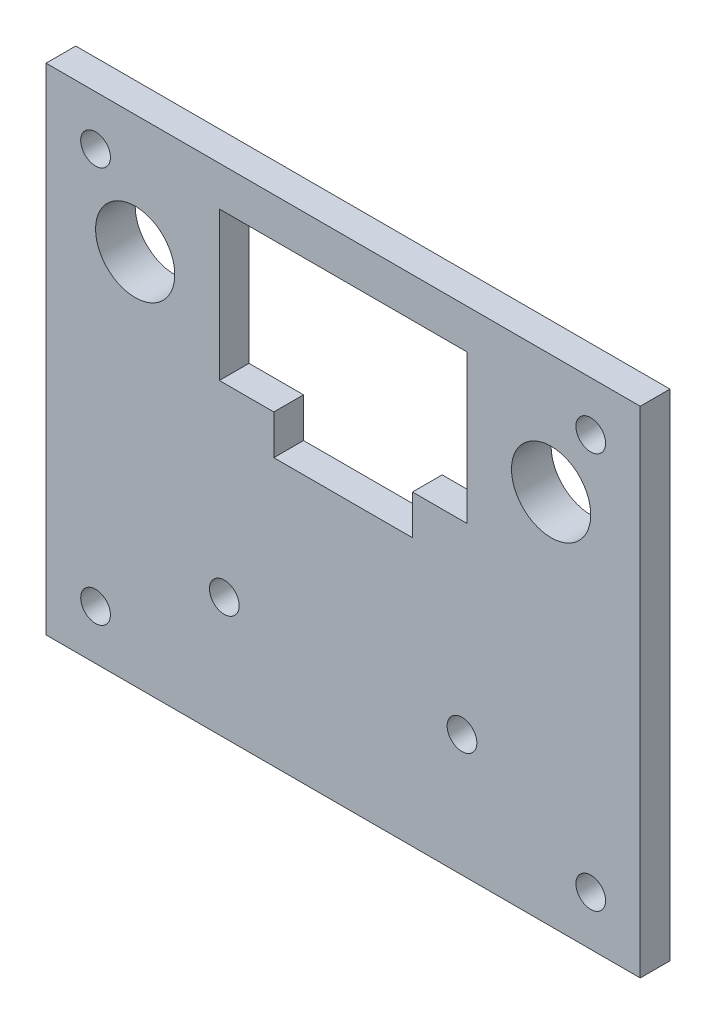
ISO-10303-21;
HEADER;
FILE_DESCRIPTION(('STEP AP214'),'2;1');
FILE_NAME('part.step','',(''),(''),'','','');
FILE_SCHEMA(('AUTOMOTIVE_DESIGN { 1 0 10303 214 1 1 1 1 }'));
ENDSEC;
DATA;
#1=APPLICATION_CONTEXT('core data for automotive mechanical design processes');
#2=APPLICATION_PROTOCOL_DEFINITION('international standard','automotive_design',2000,#1);
#3=PRODUCT_CONTEXT('',#1,'mechanical');
#4=PRODUCT('Part','Part','',(#3));
#5=PRODUCT_RELATED_PRODUCT_CATEGORY('part','',(#4));
#6=PRODUCT_DEFINITION_FORMATION('','',#4);
#7=PRODUCT_DEFINITION_CONTEXT('part definition',#1,'design');
#8=PRODUCT_DEFINITION('design','',#6,#7);
#9=PRODUCT_DEFINITION_SHAPE('','',#8);
#10=(LENGTH_UNIT() NAMED_UNIT(*) SI_UNIT(.MILLI.,.METRE.));
#11=(NAMED_UNIT(*) PLANE_ANGLE_UNIT() SI_UNIT($,.RADIAN.));
#12=(NAMED_UNIT(*) SI_UNIT($,.STERADIAN.) SOLID_ANGLE_UNIT());
#13=UNCERTAINTY_MEASURE_WITH_UNIT(LENGTH_MEASURE(1.E-05),#10,'distance_accuracy_value','');
#14=(GEOMETRIC_REPRESENTATION_CONTEXT(3) GLOBAL_UNCERTAINTY_ASSIGNED_CONTEXT((#13)) GLOBAL_UNIT_ASSIGNED_CONTEXT((#10,
#11,#12)) REPRESENTATION_CONTEXT('',''));
#15=CARTESIAN_POINT('',(0.,0.,0.));
#16=DIRECTION('',(0.,0.,1.));
#17=DIRECTION('',(1.,0.,0.));
#18=AXIS2_PLACEMENT_3D('',#15,#16,#17);
#19=CARTESIAN_POINT('',(0.,0.,0.));
#20=DIRECTION('',(0.,0.,-1.));
#21=DIRECTION('',(-1.,0.,0.));
#22=AXIS2_PLACEMENT_3D('',#19,#20,#21);
#23=PLANE('',#22);
#24=CARTESIAN_POINT('',(12.0005726945969,-12.6995313706004,0.));
#25=DIRECTION('',(0.,0.,-1.));
#26=DIRECTION('',(-1.,0.,0.));
#27=AXIS2_PLACEMENT_3D('',#24,#25,#26);
#28=CIRCLE('',#27,1.5);
#29=CARTESIAN_POINT('',(10.5005726945969,-12.6995313706004,0.));
#30=VERTEX_POINT('',#29);
#31=EDGE_CURVE('E294',#30,#30,#28,.T.);
#32=ORIENTED_EDGE('',*,*,#31,.F.);
#33=EDGE_LOOP('',(#32));
#34=FACE_BOUND('',#33,.T.);
#35=CARTESIAN_POINT('',(-12.0005726945969,-12.6995313706004,0.));
#36=DIRECTION('',(0.,0.,-1.));
#37=DIRECTION('',(1.,0.,0.));
#38=AXIS2_PLACEMENT_3D('',#35,#36,#37);
#39=CIRCLE('',#38,1.5);
#40=CARTESIAN_POINT('',(-10.5005726945969,-12.6995313706004,0.));
#41=VERTEX_POINT('',#40);
#42=EDGE_CURVE('E300',#41,#41,#39,.T.);
#43=ORIENTED_EDGE('',*,*,#42,.F.);
#44=EDGE_LOOP('',(#43));
#45=FACE_BOUND('',#44,.T.);
#46=CARTESIAN_POINT('',(-25.,20.,0.));
#47=DIRECTION('',(0.,0.,-1.));
#48=DIRECTION('',(1.,0.,0.));
#49=AXIS2_PLACEMENT_3D('',#46,#47,#48);
#50=CIRCLE('',#49,1.5);
#51=CARTESIAN_POINT('',(-23.5,20.,0.));
#52=VERTEX_POINT('',#51);
#53=EDGE_CURVE('E320',#52,#52,#50,.T.);
#54=ORIENTED_EDGE('',*,*,#53,.F.);
#55=EDGE_LOOP('',(#54));
#56=FACE_BOUND('',#55,.T.);
#57=CARTESIAN_POINT('',(-25.,-20.,0.));
#58=DIRECTION('',(0.,0.,-1.));
#59=DIRECTION('',(-1.,0.,0.));
#60=AXIS2_PLACEMENT_3D('',#57,#58,#59);
#61=CIRCLE('',#60,1.5);
#62=CARTESIAN_POINT('',(-26.5,-20.,0.));
#63=VERTEX_POINT('',#62);
#64=EDGE_CURVE('E314',#63,#63,#61,.T.);
#65=ORIENTED_EDGE('',*,*,#64,.F.);
#66=EDGE_LOOP('',(#65));
#67=FACE_BOUND('',#66,.T.);
#68=CARTESIAN_POINT('',(25.,-20.,0.));
#69=DIRECTION('',(0.,0.,-1.));
#70=DIRECTION('',(1.,0.,0.));
#71=AXIS2_PLACEMENT_3D('',#68,#69,#70);
#72=CIRCLE('',#71,1.5);
#73=CARTESIAN_POINT('',(26.5,-20.,0.));
#74=VERTEX_POINT('',#73);
#75=EDGE_CURVE('E307',#74,#74,#72,.T.);
#76=ORIENTED_EDGE('',*,*,#75,.F.);
#77=EDGE_LOOP('',(#76));
#78=FACE_BOUND('',#77,.T.);
#79=CARTESIAN_POINT('',(25.,20.,0.));
#80=DIRECTION('',(0.,0.,-1.));
#81=DIRECTION('',(-1.,0.,0.));
#82=AXIS2_PLACEMENT_3D('',#79,#80,#81);
#83=CIRCLE('',#82,1.5);
#84=CARTESIAN_POINT('',(23.5,20.,0.));
#85=VERTEX_POINT('',#84);
#86=EDGE_CURVE('E310',#85,#85,#83,.T.);
#87=ORIENTED_EDGE('',*,*,#86,.F.);
#88=EDGE_LOOP('',(#87));
#89=FACE_BOUND('',#88,.T.);
#90=DIRECTION('',(0.,-1.,0.));
#91=VECTOR('',#90,1.);
#92=CARTESIAN_POINT('',(7.,5.99999999999999,0.));
#93=LINE('',#92,#91);
#94=CARTESIAN_POINT('',(7.,5.99999999999999,0.));
#95=VERTEX_POINT('',#94);
#96=CARTESIAN_POINT('',(7.,1.99999999999999,0.));
#97=VERTEX_POINT('',#96);
#98=EDGE_CURVE('E178',#95,#97,#93,.T.);
#99=ORIENTED_EDGE('',*,*,#98,.F.);
#100=DIRECTION('',(-1.,0.,0.));
#101=VECTOR('',#100,1.);
#102=CARTESIAN_POINT('',(-12.5,6.,0.));
#103=LINE('',#102,#101);
#104=CARTESIAN_POINT('',(12.5,5.99999999999999,0.));
#105=VERTEX_POINT('',#104);
#106=EDGE_CURVE('E225',#105,#95,#103,.T.);
#107=ORIENTED_EDGE('',*,*,#106,.F.);
#108=DIRECTION('',(0.,-1.,0.));
#109=VECTOR('',#108,1.);
#110=CARTESIAN_POINT('',(12.5,21.,0.));
#111=LINE('',#110,#109);
#112=CARTESIAN_POINT('',(12.5,21.,0.));
#113=VERTEX_POINT('',#112);
#114=EDGE_CURVE('E202',#113,#105,#111,.T.);
#115=ORIENTED_EDGE('',*,*,#114,.F.);
#116=DIRECTION('',(1.,0.,0.));
#117=VECTOR('',#116,1.);
#118=CARTESIAN_POINT('',(12.5,21.,0.));
#119=LINE('',#118,#117);
#120=CARTESIAN_POINT('',(-12.5,21.,0.));
#121=VERTEX_POINT('',#120);
#122=EDGE_CURVE('E212',#121,#113,#119,.T.);
#123=ORIENTED_EDGE('',*,*,#122,.F.);
#124=DIRECTION('',(0.,1.,0.));
#125=VECTOR('',#124,1.);
#126=CARTESIAN_POINT('',(-12.5,21.,0.));
#127=LINE('',#126,#125);
#128=CARTESIAN_POINT('',(-12.5,6.,0.));
#129=VERTEX_POINT('',#128);
#130=EDGE_CURVE('E228',#129,#121,#127,.T.);
#131=ORIENTED_EDGE('',*,*,#130,.F.);
#132=CARTESIAN_POINT('',(-7.,6.,0.));
#133=VERTEX_POINT('',#132);
#134=EDGE_CURVE('E224',#133,#129,#103,.T.);
#135=ORIENTED_EDGE('',*,*,#134,.F.);
#136=DIRECTION('',(0.,1.,0.));
#137=VECTOR('',#136,1.);
#138=CARTESIAN_POINT('',(-7.,5.99999999999999,0.));
#139=LINE('',#138,#137);
#140=CARTESIAN_POINT('',(-7.,1.99999999999999,0.));
#141=VERTEX_POINT('',#140);
#142=EDGE_CURVE('E67',#141,#133,#139,.T.);
#143=ORIENTED_EDGE('',*,*,#142,.F.);
#144=DIRECTION('',(-1.,0.,0.));
#145=VECTOR('',#144,1.);
#146=CARTESIAN_POINT('',(7.,1.99999999999999,0.));
#147=LINE('',#146,#145);
#148=EDGE_CURVE('E181',#97,#141,#147,.T.);
#149=ORIENTED_EDGE('',*,*,#148,.F.);
#150=EDGE_LOOP('',(#99,#107,#115,#123,#131,#135,#143,#149));
#151=FACE_BOUND('',#150,.T.);
#152=CARTESIAN_POINT('',(-21.,13.,0.));
#153=DIRECTION('',(0.,0.,-1.));
#154=DIRECTION('',(-1.,0.,0.));
#155=AXIS2_PLACEMENT_3D('',#152,#153,#154);
#156=CIRCLE('',#155,5.);
#157=CARTESIAN_POINT('',(-26.,13.,0.));
#158=VERTEX_POINT('',#157);
#159=EDGE_CURVE('E254',#158,#158,#156,.T.);
#160=ORIENTED_EDGE('',*,*,#159,.F.);
#161=EDGE_LOOP('',(#160));
#162=FACE_BOUND('',#161,.T.);
#163=CARTESIAN_POINT('',(21.,13.,0.));
#164=DIRECTION('',(0.,0.,-1.));
#165=DIRECTION('',(-1.,0.,0.));
#166=AXIS2_PLACEMENT_3D('',#163,#164,#165);
#167=CIRCLE('',#166,5.);
#168=CARTESIAN_POINT('',(16.,13.,0.));
#169=VERTEX_POINT('',#168);
#170=EDGE_CURVE('E243',#169,#169,#167,.T.);
#171=ORIENTED_EDGE('',*,*,#170,.F.);
#172=EDGE_LOOP('',(#171));
#173=FACE_BOUND('',#172,.T.);
#174=DIRECTION('',(1.,0.,0.));
#175=VECTOR('',#174,1.);
#176=CARTESIAN_POINT('',(-30.,-25.,0.));
#177=LINE('',#176,#175);
#178=CARTESIAN_POINT('',(7.00057269459692,-25.,0.));
#179=VERTEX_POINT('',#178);
#180=CARTESIAN_POINT('',(30.,-25.,0.));
#181=VERTEX_POINT('',#180);
#182=EDGE_CURVE('E284',#179,#181,#177,.T.);
#183=ORIENTED_EDGE('',*,*,#182,.F.);
#184=DIRECTION('',(0.,-1.,0.));
#185=VECTOR('',#184,1.);
#186=CARTESIAN_POINT('',(7.00057269459692,-2.28661922185326,0.));
#187=LINE('',#186,#185);
#188=CARTESIAN_POINT('',(7.00057269459692,-2.28661922185326,0.));
#189=VERTEX_POINT('',#188);
#190=EDGE_CURVE('E59',#189,#179,#187,.T.);
#191=ORIENTED_EDGE('',*,*,#190,.F.);
#192=DIRECTION('',(1.,0.,0.));
#193=VECTOR('',#192,1.);
#194=CARTESIAN_POINT('',(7.00057269459692,-2.28661922185326,0.));
#195=LINE('',#194,#193);
#196=CARTESIAN_POINT('',(-7.42271778170829,-2.28661922185326,0.));
#197=VERTEX_POINT('',#196);
#198=EDGE_CURVE('E175',#197,#189,#195,.T.);
#199=ORIENTED_EDGE('',*,*,#198,.F.);
#200=DIRECTION('',(0.,1.,0.));
#201=VECTOR('',#200,1.);
#202=CARTESIAN_POINT('',(-7.42271778170829,-2.28661922185326,0.));
#203=LINE('',#202,#201);
#204=CARTESIAN_POINT('',(-7.42271778170829,-25.,0.));
#205=VERTEX_POINT('',#204);
#206=EDGE_CURVE('E334',#205,#197,#203,.T.);
#207=ORIENTED_EDGE('',*,*,#206,.F.);
#208=CARTESIAN_POINT('',(-30.,-25.,0.));
#209=VERTEX_POINT('',#208);
#210=EDGE_CURVE('E271',#209,#205,#177,.T.);
#211=ORIENTED_EDGE('',*,*,#210,.F.);
#212=DIRECTION('',(0.,-1.,0.));
#213=VECTOR('',#212,1.);
#214=CARTESIAN_POINT('',(-30.,-25.,0.));
#215=LINE('',#214,#213);
#216=CARTESIAN_POINT('',(-30.,25.,0.));
#217=VERTEX_POINT('',#216);
#218=EDGE_CURVE('E282',#217,#209,#215,.T.);
#219=ORIENTED_EDGE('',*,*,#218,.F.);
#220=DIRECTION('',(-1.,0.,0.));
#221=VECTOR('',#220,1.);
#222=CARTESIAN_POINT('',(-30.,25.,0.));
#223=LINE('',#222,#221);
#224=CARTESIAN_POINT('',(30.,25.,0.));
#225=VERTEX_POINT('',#224);
#226=EDGE_CURVE('E280',#225,#217,#223,.T.);
#227=ORIENTED_EDGE('',*,*,#226,.F.);
#228=DIRECTION('',(0.,1.,0.));
#229=VECTOR('',#228,1.);
#230=CARTESIAN_POINT('',(30.,-25.,0.));
#231=LINE('',#230,#229);
#232=EDGE_CURVE('E264',#181,#225,#231,.T.);
#233=ORIENTED_EDGE('',*,*,#232,.F.);
#234=EDGE_LOOP('',(#183,#191,#199,#207,#211,#219,#227,#233));
#235=FACE_BOUND('',#234,.T.);
#236=ADVANCED_FACE('F42',(#34,#45,#56,#67,#78,#89,#151,#162,#173,#235),#23,.T.);
#237=CARTESIAN_POINT('',(-12.5,6.,3.));
#238=DIRECTION('',(0.,-1.,0.));
#239=DIRECTION('',(1.,0.,0.));
#240=AXIS2_PLACEMENT_3D('',#237,#238,#239);
#241=PLANE('',#240);
#242=ORIENTED_EDGE('',*,*,#106,.T.);
#243=DIRECTION('',(0.,0.,-1.));
#244=VECTOR('',#243,1.);
#245=CARTESIAN_POINT('',(7.,5.99999999999999,3.));
#246=LINE('',#245,#244);
#247=CARTESIAN_POINT('',(7.,5.99999999999999,3.));
#248=VERTEX_POINT('',#247);
#249=EDGE_CURVE('E200',#248,#95,#246,.T.);
#250=ORIENTED_EDGE('',*,*,#249,.F.);
#251=DIRECTION('',(-1.,0.,0.));
#252=VECTOR('',#251,1.);
#253=CARTESIAN_POINT('',(-12.5,6.,3.));
#254=LINE('',#253,#252);
#255=CARTESIAN_POINT('',(12.5,5.99999999999999,3.));
#256=VERTEX_POINT('',#255);
#257=EDGE_CURVE('E213',#256,#248,#254,.T.);
#258=ORIENTED_EDGE('',*,*,#257,.F.);
#259=DIRECTION('',(0.,0.,-1.));
#260=VECTOR('',#259,1.);
#261=CARTESIAN_POINT('',(12.5,5.99999999999999,3.));
#262=LINE('',#261,#260);
#263=EDGE_CURVE('E222',#256,#105,#262,.T.);
#264=ORIENTED_EDGE('',*,*,#263,.T.);
#265=EDGE_LOOP('',(#242,#250,#258,#264));
#266=FACE_BOUND('',#265,.T.);
#267=ADVANCED_FACE('F368',(#266),#241,.F.);
#268=CARTESIAN_POINT('',(30.,-25.,3.));
#269=DIRECTION('',(-1.,0.,0.));
#270=DIRECTION('',(0.,0.,1.));
#271=AXIS2_PLACEMENT_3D('',#268,#269,#270);
#272=PLANE('',#271);
#273=ORIENTED_EDGE('',*,*,#232,.T.);
#274=DIRECTION('',(0.,0.,-1.));
#275=VECTOR('',#274,1.);
#276=CARTESIAN_POINT('',(30.,25.,3.));
#277=LINE('',#276,#275);
#278=CARTESIAN_POINT('',(30.,25.,3.));
#279=VERTEX_POINT('',#278);
#280=EDGE_CURVE('E11',#279,#225,#277,.T.);
#281=ORIENTED_EDGE('',*,*,#280,.F.);
#282=DIRECTION('',(0.,1.,0.));
#283=VECTOR('',#282,1.);
#284=CARTESIAN_POINT('',(30.,-25.,3.));
#285=LINE('',#284,#283);
#286=CARTESIAN_POINT('',(30.,-25.,3.));
#287=VERTEX_POINT('',#286);
#288=EDGE_CURVE('E267',#287,#279,#285,.T.);
#289=ORIENTED_EDGE('',*,*,#288,.F.);
#290=DIRECTION('',(0.,0.,-1.));
#291=VECTOR('',#290,1.);
#292=CARTESIAN_POINT('',(30.,-25.,3.));
#293=LINE('',#292,#291);
#294=EDGE_CURVE('E277',#287,#181,#293,.T.);
#295=ORIENTED_EDGE('',*,*,#294,.T.);
#296=EDGE_LOOP('',(#273,#281,#289,#295));
#297=FACE_BOUND('',#296,.T.);
#298=ADVANCED_FACE('F44',(#297),#272,.F.);
#299=CARTESIAN_POINT('',(-30.,25.,3.));
#300=DIRECTION('',(0.,-1.,0.));
#301=DIRECTION('',(0.,0.,-1.));
#302=AXIS2_PLACEMENT_3D('',#299,#300,#301);
#303=PLANE('',#302);
#304=ORIENTED_EDGE('',*,*,#226,.T.);
#305=DIRECTION('',(0.,0.,-1.));
#306=VECTOR('',#305,1.);
#307=CARTESIAN_POINT('',(-30.,25.,3.));
#308=LINE('',#307,#306);
#309=CARTESIAN_POINT('',(-30.,25.,3.));
#310=VERTEX_POINT('',#309);
#311=EDGE_CURVE('E51',#310,#217,#308,.T.);
#312=ORIENTED_EDGE('',*,*,#311,.F.);
#313=DIRECTION('',(-1.,0.,0.));
#314=VECTOR('',#313,1.);
#315=CARTESIAN_POINT('',(-30.,25.,3.));
#316=LINE('',#315,#314);
#317=EDGE_CURVE('E270',#279,#310,#316,.T.);
#318=ORIENTED_EDGE('',*,*,#317,.F.);
#319=ORIENTED_EDGE('',*,*,#280,.T.);
#320=EDGE_LOOP('',(#304,#312,#318,#319));
#321=FACE_BOUND('',#320,.T.);
#322=ADVANCED_FACE('F361',(#321),#303,.F.);
#323=CARTESIAN_POINT('',(-30.,-25.,3.));
#324=DIRECTION('',(1.,0.,0.));
#325=DIRECTION('',(0.,0.,-1.));
#326=AXIS2_PLACEMENT_3D('',#323,#324,#325);
#327=PLANE('',#326);
#328=ORIENTED_EDGE('',*,*,#218,.T.);
#329=DIRECTION('',(0.,0.,-1.));
#330=VECTOR('',#329,1.);
#331=CARTESIAN_POINT('',(-30.,-25.,3.));
#332=LINE('',#331,#330);
#333=CARTESIAN_POINT('',(-30.,-25.,3.));
#334=VERTEX_POINT('',#333);
#335=EDGE_CURVE('E288',#334,#209,#332,.T.);
#336=ORIENTED_EDGE('',*,*,#335,.F.);
#337=DIRECTION('',(0.,-1.,0.));
#338=VECTOR('',#337,1.);
#339=CARTESIAN_POINT('',(-30.,-25.,3.));
#340=LINE('',#339,#338);
#341=EDGE_CURVE('E273',#310,#334,#340,.T.);
#342=ORIENTED_EDGE('',*,*,#341,.F.);
#343=ORIENTED_EDGE('',*,*,#311,.T.);
#344=EDGE_LOOP('',(#328,#336,#342,#343));
#345=FACE_BOUND('',#344,.T.);
#346=ADVANCED_FACE('F359',(#345),#327,.F.);
#347=CARTESIAN_POINT('',(-30.,-25.,3.));
#348=DIRECTION('',(0.,1.,0.));
#349=DIRECTION('',(0.,0.,1.));
#350=AXIS2_PLACEMENT_3D('',#347,#348,#349);
#351=PLANE('',#350);
#352=ORIENTED_EDGE('',*,*,#210,.T.);
#353=DIRECTION('',(0.,0.,1.));
#354=VECTOR('',#353,1.);
#355=CARTESIAN_POINT('',(-7.42271778170829,-25.,-3.3));
#356=LINE('',#355,#354);
#357=CARTESIAN_POINT('',(-7.42271778170829,-25.,-3.3));
#358=VERTEX_POINT('',#357);
#359=EDGE_CURVE('E164',#358,#205,#356,.T.);
#360=ORIENTED_EDGE('',*,*,#359,.F.);
#361=DIRECTION('',(-1.,0.,0.));
#362=VECTOR('',#361,1.);
#363=CARTESIAN_POINT('',(7.00057269459692,-25.,-3.3));
#364=LINE('',#363,#362);
#365=CARTESIAN_POINT('',(7.00057269459692,-25.,-3.3));
#366=VERTEX_POINT('',#365);
#367=EDGE_CURVE('E158',#366,#358,#364,.T.);
#368=ORIENTED_EDGE('',*,*,#367,.F.);
#369=DIRECTION('',(0.,0.,1.));
#370=VECTOR('',#369,1.);
#371=CARTESIAN_POINT('',(7.00057269459692,-25.,-3.3));
#372=LINE('',#371,#370);
#373=EDGE_CURVE('E162',#366,#179,#372,.T.);
#374=ORIENTED_EDGE('',*,*,#373,.T.);
#375=ORIENTED_EDGE('',*,*,#182,.T.);
#376=ORIENTED_EDGE('',*,*,#294,.F.);
#377=DIRECTION('',(1.,0.,0.));
#378=VECTOR('',#377,1.);
#379=CARTESIAN_POINT('',(-30.,-25.,3.));
#380=LINE('',#379,#378);
#381=EDGE_CURVE('E275',#334,#287,#380,.T.);
#382=ORIENTED_EDGE('',*,*,#381,.F.);
#383=ORIENTED_EDGE('',*,*,#335,.T.);
#384=EDGE_LOOP('',(#352,#360,#368,#374,#375,#376,#382,#383));
#385=FACE_BOUND('',#384,.T.);
#386=ADVANCED_FACE('F161',(#385),#351,.F.);
#387=CARTESIAN_POINT('',(0.,0.,3.));
#388=DIRECTION('',(0.,0.,-1.));
#389=DIRECTION('',(-1.,0.,0.));
#390=AXIS2_PLACEMENT_3D('',#387,#388,#389);
#391=PLANE('',#390);
#392=CARTESIAN_POINT('',(12.0005726945969,-12.6995313706004,3.));
#393=DIRECTION('',(0.,0.,-1.));
#394=DIRECTION('',(-1.,0.,0.));
#395=AXIS2_PLACEMENT_3D('',#392,#393,#394);
#396=CIRCLE('',#395,1.5);
#397=CARTESIAN_POINT('',(10.5005726945969,-12.6995313706004,3.));
#398=VERTEX_POINT('',#397);
#399=EDGE_CURVE('E46',#398,#398,#396,.T.);
#400=ORIENTED_EDGE('',*,*,#399,.T.);
#401=EDGE_LOOP('',(#400));
#402=FACE_BOUND('',#401,.T.);
#403=CARTESIAN_POINT('',(-12.0005726945969,-12.6995313706004,3.));
#404=DIRECTION('',(0.,0.,-1.));
#405=DIRECTION('',(-1.,0.,0.));
#406=AXIS2_PLACEMENT_3D('',#403,#404,#405);
#407=CIRCLE('',#406,1.5);
#408=CARTESIAN_POINT('',(-13.5005726945969,-12.6995313706004,3.));
#409=VERTEX_POINT('',#408);
#410=EDGE_CURVE('E292',#409,#409,#407,.T.);
#411=ORIENTED_EDGE('',*,*,#410,.T.);
#412=EDGE_LOOP('',(#411));
#413=FACE_BOUND('',#412,.T.);
#414=CARTESIAN_POINT('',(-25.,20.,3.));
#415=DIRECTION('',(0.,0.,-1.));
#416=DIRECTION('',(1.,0.,0.));
#417=AXIS2_PLACEMENT_3D('',#414,#415,#416);
#418=CIRCLE('',#417,1.5);
#419=CARTESIAN_POINT('',(-23.5,20.,3.));
#420=VERTEX_POINT('',#419);
#421=EDGE_CURVE('E298',#420,#420,#418,.T.);
#422=ORIENTED_EDGE('',*,*,#421,.T.);
#423=EDGE_LOOP('',(#422));
#424=FACE_BOUND('',#423,.T.);
#425=CARTESIAN_POINT('',(-25.,-20.,3.));
#426=DIRECTION('',(0.,0.,-1.));
#427=DIRECTION('',(-1.,0.,0.));
#428=AXIS2_PLACEMENT_3D('',#425,#426,#427);
#429=CIRCLE('',#428,1.5);
#430=CARTESIAN_POINT('',(-26.5,-20.,3.));
#431=VERTEX_POINT('',#430);
#432=EDGE_CURVE('E317',#431,#431,#429,.T.);
#433=ORIENTED_EDGE('',*,*,#432,.T.);
#434=EDGE_LOOP('',(#433));
#435=FACE_BOUND('',#434,.T.);
#436=CARTESIAN_POINT('',(25.,-20.,3.));
#437=DIRECTION('',(0.,0.,-1.));
#438=DIRECTION('',(1.,0.,0.));
#439=AXIS2_PLACEMENT_3D('',#436,#437,#438);
#440=CIRCLE('',#439,1.5);
#441=CARTESIAN_POINT('',(26.5,-20.,3.));
#442=VERTEX_POINT('',#441);
#443=EDGE_CURVE('E311',#442,#442,#440,.T.);
#444=ORIENTED_EDGE('',*,*,#443,.T.);
#445=EDGE_LOOP('',(#444));
#446=FACE_BOUND('',#445,.T.);
#447=CARTESIAN_POINT('',(25.,20.,3.));
#448=DIRECTION('',(0.,0.,-1.));
#449=DIRECTION('',(-1.,0.,0.));
#450=AXIS2_PLACEMENT_3D('',#447,#448,#449);
#451=CIRCLE('',#450,1.5);
#452=CARTESIAN_POINT('',(23.5,20.,3.));
#453=VERTEX_POINT('',#452);
#454=EDGE_CURVE('E325',#453,#453,#451,.T.);
#455=ORIENTED_EDGE('',*,*,#454,.T.);
#456=EDGE_LOOP('',(#455));
#457=FACE_BOUND('',#456,.T.);
#458=ORIENTED_EDGE('',*,*,#257,.T.);
#459=DIRECTION('',(0.,-1.,0.));
#460=VECTOR('',#459,1.);
#461=CARTESIAN_POINT('',(7.,5.99999999999999,3.));
#462=LINE('',#461,#460);
#463=CARTESIAN_POINT('',(7.,1.99999999999999,3.));
#464=VERTEX_POINT('',#463);
#465=EDGE_CURVE('E187',#248,#464,#462,.T.);
#466=ORIENTED_EDGE('',*,*,#465,.T.);
#467=DIRECTION('',(-1.,0.,0.));
#468=VECTOR('',#467,1.);
#469=CARTESIAN_POINT('',(7.,1.99999999999999,3.));
#470=LINE('',#469,#468);
#471=CARTESIAN_POINT('',(-7.,1.99999999999999,3.));
#472=VERTEX_POINT('',#471);
#473=EDGE_CURVE('E190',#464,#472,#470,.T.);
#474=ORIENTED_EDGE('',*,*,#473,.T.);
#475=DIRECTION('',(0.,1.,0.));
#476=VECTOR('',#475,1.);
#477=CARTESIAN_POINT('',(-7.,5.99999999999999,3.));
#478=LINE('',#477,#476);
#479=CARTESIAN_POINT('',(-7.,5.99999999999999,3.));
#480=VERTEX_POINT('',#479);
#481=EDGE_CURVE('E193',#472,#480,#478,.T.);
#482=ORIENTED_EDGE('',*,*,#481,.T.);
#483=CARTESIAN_POINT('',(-12.5,6.,3.));
#484=VERTEX_POINT('',#483);
#485=EDGE_CURVE('E211',#480,#484,#254,.T.);
#486=ORIENTED_EDGE('',*,*,#485,.T.);
#487=DIRECTION('',(0.,1.,0.));
#488=VECTOR('',#487,1.);
#489=CARTESIAN_POINT('',(-12.5,21.,3.));
#490=LINE('',#489,#488);
#491=CARTESIAN_POINT('',(-12.5,21.,3.));
#492=VERTEX_POINT('',#491);
#493=EDGE_CURVE('E216',#484,#492,#490,.T.);
#494=ORIENTED_EDGE('',*,*,#493,.T.);
#495=DIRECTION('',(1.,0.,0.));
#496=VECTOR('',#495,1.);
#497=CARTESIAN_POINT('',(12.5,21.,3.));
#498=LINE('',#497,#496);
#499=CARTESIAN_POINT('',(12.5,21.,3.));
#500=VERTEX_POINT('',#499);
#501=EDGE_CURVE('E219',#492,#500,#498,.T.);
#502=ORIENTED_EDGE('',*,*,#501,.T.);
#503=DIRECTION('',(0.,-1.,0.));
#504=VECTOR('',#503,1.);
#505=CARTESIAN_POINT('',(12.5,21.,3.));
#506=LINE('',#505,#504);
#507=EDGE_CURVE('E208',#500,#256,#506,.T.);
#508=ORIENTED_EDGE('',*,*,#507,.T.);
#509=EDGE_LOOP('',(#458,#466,#474,#482,#486,#494,#502,#508));
#510=FACE_BOUND('',#509,.T.);
#511=CARTESIAN_POINT('',(-21.,13.,3.));
#512=DIRECTION('',(0.,0.,-1.));
#513=DIRECTION('',(-1.,0.,0.));
#514=AXIS2_PLACEMENT_3D('',#511,#512,#513);
#515=CIRCLE('',#514,4.);
#516=CARTESIAN_POINT('',(-25.,13.,3.));
#517=VERTEX_POINT('',#516);
#518=EDGE_CURVE('E261',#517,#517,#515,.T.);
#519=ORIENTED_EDGE('',*,*,#518,.T.);
#520=EDGE_LOOP('',(#519));
#521=FACE_BOUND('',#520,.T.);
#522=CARTESIAN_POINT('',(21.,13.,3.));
#523=DIRECTION('',(0.,0.,-1.));
#524=DIRECTION('',(1.,0.,0.));
#525=AXIS2_PLACEMENT_3D('',#522,#523,#524);
#526=CIRCLE('',#525,4.);
#527=CARTESIAN_POINT('',(25.,13.,3.));
#528=VERTEX_POINT('',#527);
#529=EDGE_CURVE('E258',#528,#528,#526,.T.);
#530=ORIENTED_EDGE('',*,*,#529,.T.);
#531=EDGE_LOOP('',(#530));
#532=FACE_BOUND('',#531,.T.);
#533=ORIENTED_EDGE('',*,*,#288,.T.);
#534=ORIENTED_EDGE('',*,*,#317,.T.);
#535=ORIENTED_EDGE('',*,*,#341,.T.);
#536=ORIENTED_EDGE('',*,*,#381,.T.);
#537=EDGE_LOOP('',(#533,#534,#535,#536));
#538=FACE_BOUND('',#537,.T.);
#539=ADVANCED_FACE('F353',(#402,#413,#424,#435,#446,#457,#510,#521,#532,#538),#391,.F.);
#540=CARTESIAN_POINT('',(21.,13.,3.));
#541=DIRECTION('',(0.,0.,-1.));
#542=DIRECTION('',(-1.,0.,0.));
#543=AXIS2_PLACEMENT_3D('',#540,#541,#542);
#544=CYLINDRICAL_SURFACE('',#543,4.);
#545=ORIENTED_EDGE('',*,*,#529,.F.);
#546=EDGE_LOOP('',(#545));
#547=FACE_BOUND('',#546,.T.);
#548=CARTESIAN_POINT('',(21.,13.,-1.));
#549=DIRECTION('',(0.,0.,-1.));
#550=DIRECTION('',(-1.,0.,0.));
#551=AXIS2_PLACEMENT_3D('',#548,#549,#550);
#552=CIRCLE('',#551,4.);
#553=CARTESIAN_POINT('',(17.,13.,-1.));
#554=VERTEX_POINT('',#553);
#555=EDGE_CURVE('E246',#554,#554,#552,.T.);
#556=ORIENTED_EDGE('',*,*,#555,.T.);
#557=EDGE_LOOP('',(#556));
#558=FACE_BOUND('',#557,.T.);
#559=ADVANCED_FACE('F388',(#547,#558),#544,.F.);
#560=CARTESIAN_POINT('',(-21.,13.,3.));
#561=DIRECTION('',(0.,0.,-1.));
#562=DIRECTION('',(-1.,0.,0.));
#563=AXIS2_PLACEMENT_3D('',#560,#561,#562);
#564=CYLINDRICAL_SURFACE('',#563,4.);
#565=ORIENTED_EDGE('',*,*,#518,.F.);
#566=EDGE_LOOP('',(#565));
#567=FACE_BOUND('',#566,.T.);
#568=CARTESIAN_POINT('',(-21.,13.,-1.));
#569=DIRECTION('',(0.,0.,-1.));
#570=DIRECTION('',(-1.,0.,0.));
#571=AXIS2_PLACEMENT_3D('',#568,#569,#570);
#572=CIRCLE('',#571,4.);
#573=CARTESIAN_POINT('',(-25.,13.,-1.));
#574=VERTEX_POINT('',#573);
#575=EDGE_CURVE('E251',#574,#574,#572,.T.);
#576=ORIENTED_EDGE('',*,*,#575,.T.);
#577=EDGE_LOOP('',(#576));
#578=FACE_BOUND('',#577,.T.);
#579=ADVANCED_FACE('F393',(#567,#578),#564,.F.);
#580=CARTESIAN_POINT('',(-21.,13.,-1.));
#581=DIRECTION('',(0.,0.,-1.));
#582=DIRECTION('',(-1.,0.,0.));
#583=AXIS2_PLACEMENT_3D('',#580,#581,#582);
#584=PLANE('',#583);
#585=CARTESIAN_POINT('',(-21.,13.,-1.));
#586=DIRECTION('',(0.,0.,-1.));
#587=DIRECTION('',(-1.,0.,0.));
#588=AXIS2_PLACEMENT_3D('',#585,#586,#587);
#589=CIRCLE('',#588,5.);
#590=CARTESIAN_POINT('',(-26.,13.,-1.));
#591=VERTEX_POINT('',#590);
#592=EDGE_CURVE('E255',#591,#591,#589,.T.);
#593=ORIENTED_EDGE('',*,*,#592,.T.);
#594=EDGE_LOOP('',(#593));
#595=FACE_BOUND('',#594,.T.);
#596=ORIENTED_EDGE('',*,*,#575,.F.);
#597=EDGE_LOOP('',(#596));
#598=FACE_BOUND('',#597,.T.);
#599=ADVANCED_FACE('F426',(#595,#598),#584,.T.);
#600=CARTESIAN_POINT('',(-21.,13.,-1.));
#601=DIRECTION('',(0.,0.,1.));
#602=DIRECTION('',(1.,0.,0.));
#603=AXIS2_PLACEMENT_3D('',#600,#601,#602);
#604=CYLINDRICAL_SURFACE('',#603,5.);
#605=ORIENTED_EDGE('',*,*,#592,.F.);
#606=EDGE_LOOP('',(#605));
#607=FACE_BOUND('',#606,.T.);
#608=ORIENTED_EDGE('',*,*,#159,.T.);
#609=EDGE_LOOP('',(#608));
#610=FACE_BOUND('',#609,.T.);
#611=ADVANCED_FACE('F416',(#607,#610),#604,.T.);
#612=CARTESIAN_POINT('',(21.,13.,-1.));
#613=DIRECTION('',(0.,0.,-1.));
#614=DIRECTION('',(-1.,0.,0.));
#615=AXIS2_PLACEMENT_3D('',#612,#613,#614);
#616=PLANE('',#615);
#617=CARTESIAN_POINT('',(21.,13.,-1.));
#618=DIRECTION('',(0.,0.,-1.));
#619=DIRECTION('',(-1.,0.,0.));
#620=AXIS2_PLACEMENT_3D('',#617,#618,#619);
#621=CIRCLE('',#620,5.);
#622=CARTESIAN_POINT('',(16.,13.,-1.));
#623=VERTEX_POINT('',#622);
#624=EDGE_CURVE('E235',#623,#623,#621,.T.);
#625=ORIENTED_EDGE('',*,*,#624,.T.);
#626=EDGE_LOOP('',(#625));
#627=FACE_BOUND('',#626,.T.);
#628=ORIENTED_EDGE('',*,*,#555,.F.);
#629=EDGE_LOOP('',(#628));
#630=FACE_BOUND('',#629,.T.);
#631=ADVANCED_FACE('F413',(#627,#630),#616,.T.);
#632=CARTESIAN_POINT('',(21.,13.,-1.));
#633=DIRECTION('',(0.,0.,1.));
#634=DIRECTION('',(1.,0.,0.));
#635=AXIS2_PLACEMENT_3D('',#632,#633,#634);
#636=CYLINDRICAL_SURFACE('',#635,5.);
#637=ORIENTED_EDGE('',*,*,#624,.F.);
#638=EDGE_LOOP('',(#637));
#639=FACE_BOUND('',#638,.T.);
#640=ORIENTED_EDGE('',*,*,#170,.T.);
#641=EDGE_LOOP('',(#640));
#642=FACE_BOUND('',#641,.T.);
#643=ADVANCED_FACE('F415',(#639,#642),#636,.T.);
#644=CARTESIAN_POINT('',(12.5,21.,3.));
#645=DIRECTION('',(1.,0.,0.));
#646=DIRECTION('',(0.,1.,0.));
#647=AXIS2_PLACEMENT_3D('',#644,#645,#646);
#648=PLANE('',#647);
#649=ORIENTED_EDGE('',*,*,#114,.T.);
#650=ORIENTED_EDGE('',*,*,#263,.F.);
#651=ORIENTED_EDGE('',*,*,#507,.F.);
#652=DIRECTION('',(0.,0.,-1.));
#653=VECTOR('',#652,1.);
#654=CARTESIAN_POINT('',(12.5,21.,3.));
#655=LINE('',#654,#653);
#656=EDGE_CURVE('E233',#500,#113,#655,.T.);
#657=ORIENTED_EDGE('',*,*,#656,.T.);
#658=EDGE_LOOP('',(#649,#650,#651,#657));
#659=FACE_BOUND('',#658,.T.);
#660=ADVANCED_FACE('F423',(#659),#648,.F.);
#661=CARTESIAN_POINT('',(12.5,21.,3.));
#662=DIRECTION('',(0.,1.,0.));
#663=DIRECTION('',(-1.,0.,0.));
#664=AXIS2_PLACEMENT_3D('',#661,#662,#663);
#665=PLANE('',#664);
#666=ORIENTED_EDGE('',*,*,#122,.T.);
#667=ORIENTED_EDGE('',*,*,#656,.F.);
#668=ORIENTED_EDGE('',*,*,#501,.F.);
#669=DIRECTION('',(0.,0.,-1.));
#670=VECTOR('',#669,1.);
#671=CARTESIAN_POINT('',(-12.5,21.,3.));
#672=LINE('',#671,#670);
#673=EDGE_CURVE('E236',#492,#121,#672,.T.);
#674=ORIENTED_EDGE('',*,*,#673,.T.);
#675=EDGE_LOOP('',(#666,#667,#668,#674));
#676=FACE_BOUND('',#675,.T.);
#677=ADVANCED_FACE('F473',(#676),#665,.F.);
#678=CARTESIAN_POINT('',(-12.5,21.,3.));
#679=DIRECTION('',(-1.,0.,0.));
#680=DIRECTION('',(0.,-1.,0.));
#681=AXIS2_PLACEMENT_3D('',#678,#679,#680);
#682=PLANE('',#681);
#683=ORIENTED_EDGE('',*,*,#130,.T.);
#684=ORIENTED_EDGE('',*,*,#673,.F.);
#685=ORIENTED_EDGE('',*,*,#493,.F.);
#686=DIRECTION('',(0.,0.,-1.));
#687=VECTOR('',#686,1.);
#688=CARTESIAN_POINT('',(-12.5,6.,3.));
#689=LINE('',#688,#687);
#690=EDGE_CURVE('E238',#484,#129,#689,.T.);
#691=ORIENTED_EDGE('',*,*,#690,.T.);
#692=EDGE_LOOP('',(#683,#684,#685,#691));
#693=FACE_BOUND('',#692,.T.);
#694=ADVANCED_FACE('F483',(#693),#682,.F.);
#695=ORIENTED_EDGE('',*,*,#485,.F.);
#696=DIRECTION('',(0.,0.,-1.));
#697=VECTOR('',#696,1.);
#698=CARTESIAN_POINT('',(-7.,5.99999999999999,3.));
#699=LINE('',#698,#697);
#700=EDGE_CURVE('E203',#480,#133,#699,.T.);
#701=ORIENTED_EDGE('',*,*,#700,.T.);
#702=ORIENTED_EDGE('',*,*,#134,.T.);
#703=ORIENTED_EDGE('',*,*,#690,.F.);
#704=EDGE_LOOP('',(#695,#701,#702,#703));
#705=FACE_BOUND('',#704,.T.);
#706=ADVANCED_FACE('F379',(#705),#241,.F.);
#707=CARTESIAN_POINT('',(7.,5.99999999999999,3.));
#708=DIRECTION('',(1.,0.,0.));
#709=DIRECTION('',(0.,0.,-1.));
#710=AXIS2_PLACEMENT_3D('',#707,#708,#709);
#711=PLANE('',#710);
#712=ORIENTED_EDGE('',*,*,#98,.T.);
#713=DIRECTION('',(0.,0.,-1.));
#714=VECTOR('',#713,1.);
#715=CARTESIAN_POINT('',(7.,1.99999999999999,3.));
#716=LINE('',#715,#714);
#717=EDGE_CURVE('E195',#464,#97,#716,.T.);
#718=ORIENTED_EDGE('',*,*,#717,.F.);
#719=ORIENTED_EDGE('',*,*,#465,.F.);
#720=ORIENTED_EDGE('',*,*,#249,.T.);
#721=EDGE_LOOP('',(#712,#718,#719,#720));
#722=FACE_BOUND('',#721,.T.);
#723=ADVANCED_FACE('F512',(#722),#711,.F.);
#724=CARTESIAN_POINT('',(-7.,5.99999999999999,3.));
#725=DIRECTION('',(-1.,0.,0.));
#726=DIRECTION('',(0.,-1.,0.));
#727=AXIS2_PLACEMENT_3D('',#724,#725,#726);
#728=PLANE('',#727);
#729=ORIENTED_EDGE('',*,*,#142,.T.);
#730=ORIENTED_EDGE('',*,*,#700,.F.);
#731=ORIENTED_EDGE('',*,*,#481,.F.);
#732=DIRECTION('',(0.,0.,-1.));
#733=VECTOR('',#732,1.);
#734=CARTESIAN_POINT('',(-7.,1.99999999999999,3.));
#735=LINE('',#734,#733);
#736=EDGE_CURVE('E205',#472,#141,#735,.T.);
#737=ORIENTED_EDGE('',*,*,#736,.T.);
#738=EDGE_LOOP('',(#729,#730,#731,#737));
#739=FACE_BOUND('',#738,.T.);
#740=ADVANCED_FACE('F521',(#739),#728,.F.);
#741=CARTESIAN_POINT('',(7.,1.99999999999999,3.));
#742=DIRECTION('',(0.,-1.,0.));
#743=DIRECTION('',(0.,0.,-1.));
#744=AXIS2_PLACEMENT_3D('',#741,#742,#743);
#745=PLANE('',#744);
#746=ORIENTED_EDGE('',*,*,#148,.T.);
#747=ORIENTED_EDGE('',*,*,#736,.F.);
#748=ORIENTED_EDGE('',*,*,#473,.F.);
#749=ORIENTED_EDGE('',*,*,#717,.T.);
#750=EDGE_LOOP('',(#746,#747,#748,#749));
#751=FACE_BOUND('',#750,.T.);
#752=ADVANCED_FACE('F531',(#751),#745,.F.);
#753=CARTESIAN_POINT('',(7.00057269459692,-2.28661922185326,-3.3));
#754=DIRECTION('',(-1.,0.,0.));
#755=DIRECTION('',(0.,0.,1.));
#756=AXIS2_PLACEMENT_3D('',#753,#754,#755);
#757=PLANE('',#756);
#758=ORIENTED_EDGE('',*,*,#190,.T.);
#759=ORIENTED_EDGE('',*,*,#373,.F.);
#760=DIRECTION('',(0.,-1.,0.));
#761=VECTOR('',#760,1.);
#762=CARTESIAN_POINT('',(7.00057269459692,-2.28661922185326,-3.3));
#763=LINE('',#762,#761);
#764=CARTESIAN_POINT('',(7.00057269459692,-2.28661922185326,-3.3));
#765=VERTEX_POINT('',#764);
#766=EDGE_CURVE('E168',#765,#366,#763,.T.);
#767=ORIENTED_EDGE('',*,*,#766,.F.);
#768=DIRECTION('',(0.,0.,1.));
#769=VECTOR('',#768,1.);
#770=CARTESIAN_POINT('',(7.00057269459692,-2.28661922185326,-3.3));
#771=LINE('',#770,#769);
#772=EDGE_CURVE('E332',#765,#189,#771,.T.);
#773=ORIENTED_EDGE('',*,*,#772,.T.);
#774=EDGE_LOOP('',(#758,#759,#767,#773));
#775=FACE_BOUND('',#774,.T.);
#776=ADVANCED_FACE('F177',(#775),#757,.F.);
#777=CARTESIAN_POINT('',(-7.42271778170829,-2.28661922185326,-3.3));
#778=DIRECTION('',(1.,0.,0.));
#779=DIRECTION('',(0.,0.,-1.));
#780=AXIS2_PLACEMENT_3D('',#777,#778,#779);
#781=PLANE('',#780);
#782=ORIENTED_EDGE('',*,*,#206,.T.);
#783=DIRECTION('',(0.,0.,1.));
#784=VECTOR('',#783,1.);
#785=CARTESIAN_POINT('',(-7.42271778170829,-2.28661922185326,-3.3));
#786=LINE('',#785,#784);
#787=CARTESIAN_POINT('',(-7.42271778170829,-2.28661922185326,-3.3));
#788=VERTEX_POINT('',#787);
#789=EDGE_CURVE('E183',#788,#197,#786,.T.);
#790=ORIENTED_EDGE('',*,*,#789,.F.);
#791=DIRECTION('',(0.,1.,0.));
#792=VECTOR('',#791,1.);
#793=CARTESIAN_POINT('',(-7.42271778170829,-2.28661922185326,-3.3));
#794=LINE('',#793,#792);
#795=EDGE_CURVE('E167',#358,#788,#794,.T.);
#796=ORIENTED_EDGE('',*,*,#795,.F.);
#797=ORIENTED_EDGE('',*,*,#359,.T.);
#798=EDGE_LOOP('',(#782,#790,#796,#797));
#799=FACE_BOUND('',#798,.T.);
#800=ADVANCED_FACE('F557',(#799),#781,.F.);
#801=CARTESIAN_POINT('',(7.00057269459692,-2.28661922185326,-3.3));
#802=DIRECTION('',(0.,-1.,0.));
#803=DIRECTION('',(0.,0.,-1.));
#804=AXIS2_PLACEMENT_3D('',#801,#802,#803);
#805=PLANE('',#804);
#806=ORIENTED_EDGE('',*,*,#198,.T.);
#807=ORIENTED_EDGE('',*,*,#772,.F.);
#808=DIRECTION('',(1.,0.,0.));
#809=VECTOR('',#808,1.);
#810=CARTESIAN_POINT('',(7.00057269459692,-2.28661922185326,-3.3));
#811=LINE('',#810,#809);
#812=EDGE_CURVE('E173',#788,#765,#811,.T.);
#813=ORIENTED_EDGE('',*,*,#812,.F.);
#814=ORIENTED_EDGE('',*,*,#789,.T.);
#815=EDGE_LOOP('',(#806,#807,#813,#814));
#816=FACE_BOUND('',#815,.T.);
#817=ADVANCED_FACE('F341',(#816),#805,.F.);
#818=CARTESIAN_POINT('',(0.,0.,-3.3));
#819=DIRECTION('',(0.,0.,-1.));
#820=DIRECTION('',(-1.,0.,0.));
#821=AXIS2_PLACEMENT_3D('',#818,#819,#820);
#822=PLANE('',#821);
#823=ORIENTED_EDGE('',*,*,#766,.T.);
#824=ORIENTED_EDGE('',*,*,#367,.T.);
#825=ORIENTED_EDGE('',*,*,#795,.T.);
#826=ORIENTED_EDGE('',*,*,#812,.T.);
#827=EDGE_LOOP('',(#823,#824,#825,#826));
#828=FACE_BOUND('',#827,.T.);
#829=ADVANCED_FACE('F171',(#828),#822,.T.);
#830=CARTESIAN_POINT('',(25.,20.,3.));
#831=DIRECTION('',(0.,0.,-1.));
#832=DIRECTION('',(-1.,0.,0.));
#833=AXIS2_PLACEMENT_3D('',#830,#831,#832);
#834=CYLINDRICAL_SURFACE('',#833,1.5);
#835=ORIENTED_EDGE('',*,*,#454,.F.);
#836=EDGE_LOOP('',(#835));
#837=FACE_BOUND('',#836,.T.);
#838=ORIENTED_EDGE('',*,*,#86,.T.);
#839=EDGE_LOOP('',(#838));
#840=FACE_BOUND('',#839,.T.);
#841=ADVANCED_FACE('F585',(#837,#840),#834,.F.);
#842=CARTESIAN_POINT('',(25.,-20.,3.));
#843=DIRECTION('',(0.,0.,-1.));
#844=DIRECTION('',(-1.,0.,0.));
#845=AXIS2_PLACEMENT_3D('',#842,#843,#844);
#846=CYLINDRICAL_SURFACE('',#845,1.5);
#847=ORIENTED_EDGE('',*,*,#443,.F.);
#848=EDGE_LOOP('',(#847));
#849=FACE_BOUND('',#848,.T.);
#850=ORIENTED_EDGE('',*,*,#75,.T.);
#851=EDGE_LOOP('',(#850));
#852=FACE_BOUND('',#851,.T.);
#853=ADVANCED_FACE('F595',(#849,#852),#846,.F.);
#854=CARTESIAN_POINT('',(-25.,-20.,3.));
#855=DIRECTION('',(0.,0.,-1.));
#856=DIRECTION('',(-1.,0.,0.));
#857=AXIS2_PLACEMENT_3D('',#854,#855,#856);
#858=CYLINDRICAL_SURFACE('',#857,1.5);
#859=ORIENTED_EDGE('',*,*,#432,.F.);
#860=EDGE_LOOP('',(#859));
#861=FACE_BOUND('',#860,.T.);
#862=ORIENTED_EDGE('',*,*,#64,.T.);
#863=EDGE_LOOP('',(#862));
#864=FACE_BOUND('',#863,.T.);
#865=ADVANCED_FACE('F606',(#861,#864),#858,.F.);
#866=CARTESIAN_POINT('',(-25.,20.,3.));
#867=DIRECTION('',(0.,0.,-1.));
#868=DIRECTION('',(-1.,0.,0.));
#869=AXIS2_PLACEMENT_3D('',#866,#867,#868);
#870=CYLINDRICAL_SURFACE('',#869,1.5);
#871=ORIENTED_EDGE('',*,*,#421,.F.);
#872=EDGE_LOOP('',(#871));
#873=FACE_BOUND('',#872,.T.);
#874=ORIENTED_EDGE('',*,*,#53,.T.);
#875=EDGE_LOOP('',(#874));
#876=FACE_BOUND('',#875,.T.);
#877=ADVANCED_FACE('F616',(#873,#876),#870,.F.);
#878=CARTESIAN_POINT('',(-12.0005726945969,-12.6995313706004,10.));
#879=DIRECTION('',(0.,0.,-1.));
#880=DIRECTION('',(-1.,0.,0.));
#881=AXIS2_PLACEMENT_3D('',#878,#879,#880);
#882=CYLINDRICAL_SURFACE('',#881,1.5);
#883=ORIENTED_EDGE('',*,*,#42,.T.);
#884=EDGE_LOOP('',(#883));
#885=FACE_BOUND('',#884,.T.);
#886=ORIENTED_EDGE('',*,*,#410,.F.);
#887=EDGE_LOOP('',(#886));
#888=FACE_BOUND('',#887,.T.);
#889=ADVANCED_FACE('F626',(#885,#888),#882,.F.);
#890=CARTESIAN_POINT('',(12.0005726945969,-12.6995313706004,10.));
#891=DIRECTION('',(0.,0.,-1.));
#892=DIRECTION('',(-1.,0.,0.));
#893=AXIS2_PLACEMENT_3D('',#890,#891,#892);
#894=CYLINDRICAL_SURFACE('',#893,1.5);
#895=ORIENTED_EDGE('',*,*,#31,.T.);
#896=EDGE_LOOP('',(#895));
#897=FACE_BOUND('',#896,.T.);
#898=ORIENTED_EDGE('',*,*,#399,.F.);
#899=EDGE_LOOP('',(#898));
#900=FACE_BOUND('',#899,.T.);
#901=ADVANCED_FACE('F637',(#897,#900),#894,.F.);
#902=CLOSED_SHELL('',(#236,#267,#298,#322,#346,#386,#539,#559,#579,#599,#611,#631,#643,#660,
#677,#694,#706,#723,#740,#752,#776,#800,#817,#829,#841,#853,#865,#877,#889,#901));
#903=MANIFOLD_SOLID_BREP('B2',#902);
#904=ADVANCED_BREP_SHAPE_REPRESENTATION('',(#18,#903),#14);
#905=SHAPE_DEFINITION_REPRESENTATION(#9,#904);
ENDSEC;
END-ISO-10303-21;
